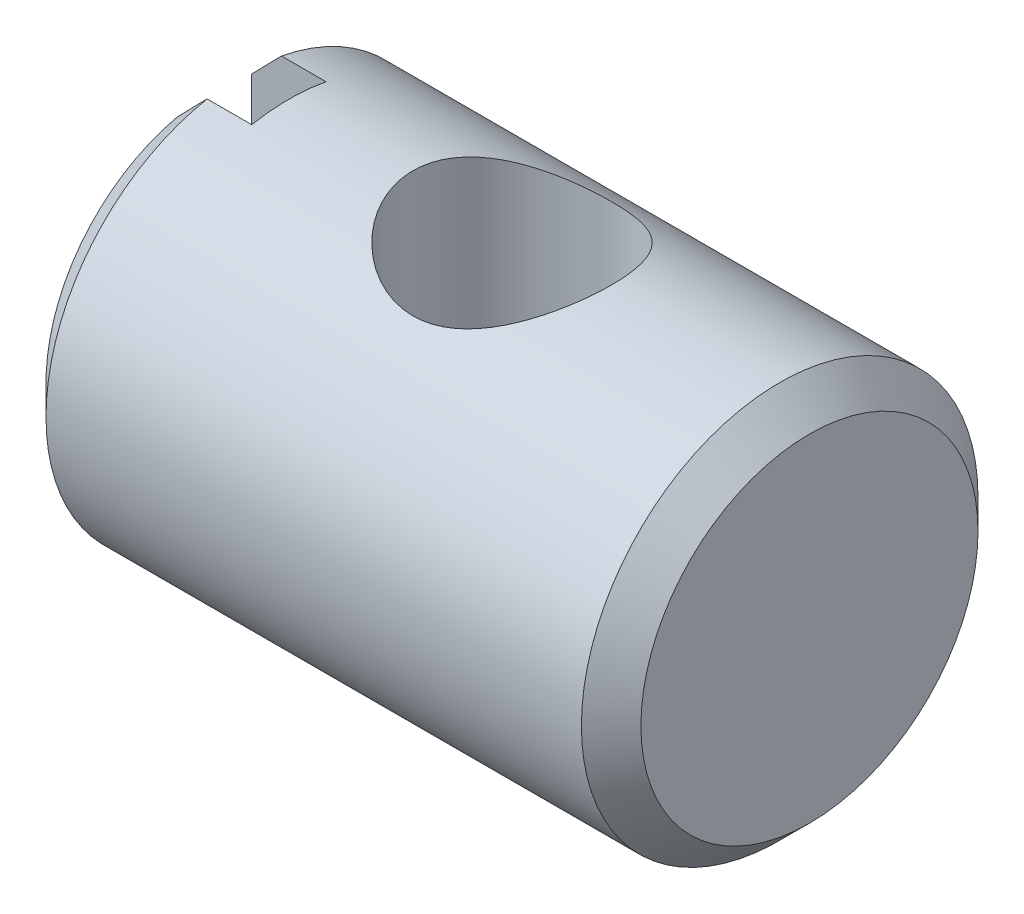
ISO-10303-21;
HEADER;
FILE_DESCRIPTION(('STEP AP214'),'2;1');
FILE_NAME('part.step','',(''),(''),'','','');
FILE_SCHEMA(('AUTOMOTIVE_DESIGN { 1 0 10303 214 1 1 1 1 }'));
ENDSEC;
DATA;
#1=APPLICATION_CONTEXT('core data for automotive mechanical design processes');
#2=APPLICATION_PROTOCOL_DEFINITION('international standard','automotive_design',2000,#1);
#3=PRODUCT_CONTEXT('',#1,'mechanical');
#4=PRODUCT('Part','Part','',(#3));
#5=PRODUCT_RELATED_PRODUCT_CATEGORY('part','',(#4));
#6=PRODUCT_DEFINITION_FORMATION('','',#4);
#7=PRODUCT_DEFINITION_CONTEXT('part definition',#1,'design');
#8=PRODUCT_DEFINITION('design','',#6,#7);
#9=PRODUCT_DEFINITION_SHAPE('','',#8);
#10=(LENGTH_UNIT() NAMED_UNIT(*) SI_UNIT(.MILLI.,.METRE.));
#11=(NAMED_UNIT(*) PLANE_ANGLE_UNIT() SI_UNIT($,.RADIAN.));
#12=(NAMED_UNIT(*) SI_UNIT($,.STERADIAN.) SOLID_ANGLE_UNIT());
#13=UNCERTAINTY_MEASURE_WITH_UNIT(LENGTH_MEASURE(1.E-05),#10,'distance_accuracy_value','');
#14=(GEOMETRIC_REPRESENTATION_CONTEXT(3) GLOBAL_UNCERTAINTY_ASSIGNED_CONTEXT((#13)) GLOBAL_UNIT_ASSIGNED_CONTEXT((#10,
#11,#12)) REPRESENTATION_CONTEXT('',''));
#15=CARTESIAN_POINT('',(0.,0.,0.));
#16=DIRECTION('',(0.,0.,1.));
#17=DIRECTION('',(1.,0.,0.));
#18=AXIS2_PLACEMENT_3D('',#15,#16,#17);
#19=CARTESIAN_POINT('',(-6.,0.,0.));
#20=DIRECTION('',(1.,0.,0.));
#21=DIRECTION('',(0.,0.,-1.));
#22=AXIS2_PLACEMENT_3D('',#19,#20,#21);
#23=PLANE('',#22);
#24=CARTESIAN_POINT('',(-6.,0.,0.));
#25=DIRECTION('',(1.,0.,0.));
#26=DIRECTION('',(0.,0.,-1.));
#27=AXIS2_PLACEMENT_3D('',#24,#25,#26);
#28=CIRCLE('',#27,3.4);
#29=CARTESIAN_POINT('',(-6.,3.31624787975808,-0.75));
#30=VERTEX_POINT('',#29);
#31=CARTESIAN_POINT('',(-6.,-3.31624787975808,-0.75));
#32=VERTEX_POINT('',#31);
#33=EDGE_CURVE('E104',#30,#32,#28,.F.);
#34=ORIENTED_EDGE('',*,*,#33,.T.);
#35=DIRECTION('',(0.,-1.,0.));
#36=VECTOR('',#35,1.);
#37=CARTESIAN_POINT('',(-6.,-5.08936353423906,-0.75));
#38=LINE('',#37,#36);
#39=EDGE_CURVE('E100',#30,#32,#38,.T.);
#40=ORIENTED_EDGE('',*,*,#39,.F.);
#41=EDGE_LOOP('',(#34,#40));
#42=FACE_BOUND('',#41,.T.);
#43=ADVANCED_FACE('F33',(#42),#23,.F.);
#44=CARTESIAN_POINT('',(-5.4,0.,0.));
#45=DIRECTION('',(1.,0.,0.));
#46=DIRECTION('',(0.,0.,-1.));
#47=AXIS2_PLACEMENT_3D('',#44,#45,#46);
#48=CONICAL_SURFACE('',#47,4.,0.785398163397448);
#49=CARTESIAN_POINT('',(-0.586318931168419,8.78171247440271,-0.75));
#50=CARTESIAN_POINT('',(-0.89911517881567,8.46776722729489,-0.75));
#51=CARTESIAN_POINT('',(-1.21186022148148,8.1537708958006,-0.75));
#52=CARTESIAN_POINT('',(-1.83719494459531,7.52558697275872,-0.75));
#53=CARTESIAN_POINT('',(-2.14978461487386,7.21139937108854,-0.75));
#54=CARTESIAN_POINT('',(-2.77515805316192,6.58233891694838,-0.75));
#55=CARTESIAN_POINT('',(-3.08794147672292,6.26746572194293,-0.75));
#56=CARTESIAN_POINT('',(-3.71310786552485,5.63735753970191,-0.75));
#57=CARTESIAN_POINT('',(-4.02549085255156,5.32212257408525,-0.75));
#58=CARTESIAN_POINT('',(-4.63095471200261,4.70991108309659,-0.75));
#59=CARTESIAN_POINT('',(-4.92407209660478,4.41297070666081,-0.75));
#60=CARTESIAN_POINT('',(-5.36301711479325,3.96679034127691,-0.75));
#61=CARTESIAN_POINT('',(-5.50922280774287,3.81792242946439,-0.75));
#62=CARTESIAN_POINT('',(-5.8012714742329,3.51983580450674,-0.75));
#63=CARTESIAN_POINT('',(-5.94711445356469,3.37061709703764,-0.75));
#64=CARTESIAN_POINT('',(-6.23815525647998,3.07179369372605,-0.75));
#65=CARTESIAN_POINT('',(-6.383353516978,2.92218942405654,-0.75));
#66=CARTESIAN_POINT('',(-6.6729455601872,2.62218613066518,-0.75));
#67=CARTESIAN_POINT('',(-6.81733929236243,2.47178705814911,-0.75));
#68=CARTESIAN_POINT('',(-7.10475426782723,2.16976130425436,-0.75));
#69=CARTESIAN_POINT('',(-7.2477759093094,2.01813500412178,-0.75));
#70=CARTESIAN_POINT('',(-7.46040576630658,1.78894239159525,-0.75));
#71=CARTESIAN_POINT('',(-7.53096183090568,1.71225650870654,-0.75));
#72=CARTESIAN_POINT('',(-7.67114403465676,1.55804045062791,-0.75));
#73=CARTESIAN_POINT('',(-7.74077020981574,1.48051030834152,-0.75));
#74=CARTESIAN_POINT('',(-7.82894089355626,1.38051818592761,-0.75));
#75=CARTESIAN_POINT('',(-7.84814001283776,1.35863324199629,-0.75));
#76=CARTESIAN_POINT('',(-7.88640996667428,1.31475109781654,-0.75));
#77=CARTESIAN_POINT('',(-7.9054807998849,1.29275389639593,-0.75));
#78=CARTESIAN_POINT('',(-7.96247837839367,1.22656954820506,-0.75));
#79=CARTESIAN_POINT('',(-8.00018671971951,1.18219359522638,-0.75));
#80=CARTESIAN_POINT('',(-8.07521139767381,1.09232954284376,-0.75));
#81=CARTESIAN_POINT('',(-8.11251967226824,1.04683469214758,-0.75));
#82=CARTESIAN_POINT('',(-8.18603196961103,0.954975461061185,-0.75));
#83=CARTESIAN_POINT('',(-8.22223626899139,0.908611303281593,-0.75));
#84=CARTESIAN_POINT('',(-8.29348308271563,0.814159220934126,-0.75));
#85=CARTESIAN_POINT('',(-8.32850767361611,0.76605767964873,-0.75));
#86=CARTESIAN_POINT('',(-8.39620368659304,0.668105125068649,-0.75));
#87=CARTESIAN_POINT('',(-8.42887194187332,0.618251886557387,-0.75));
#88=CARTESIAN_POINT('',(-8.49011198361584,0.516746551056438,-0.75));
#89=CARTESIAN_POINT('',(-8.51872209860146,0.465117942665969,-0.75));
#90=CARTESIAN_POINT('',(-8.56982814317297,0.358933249234864,-0.75));
#91=CARTESIAN_POINT('',(-8.59234286669187,0.30438679840185,-0.75));
#92=CARTESIAN_POINT('',(-8.61802261195062,0.222661735256584,-0.75));
#93=CARTESIAN_POINT('',(-8.62505610986014,0.196705154324282,-0.75));
#94=CARTESIAN_POINT('',(-8.63668327119189,0.144243129404284,-0.75));
#95=CARTESIAN_POINT('',(-8.64127731698223,0.117737772110777,-0.75));
#96=CARTESIAN_POINT('',(-8.64768999327354,0.0645252709876592,-0.75));
#97=CARTESIAN_POINT('',(-8.64952279966187,0.0378198701031724,-0.75));
#98=CARTESIAN_POINT('',(-8.6503131508692,-0.0156348454490843,-0.75));
#99=CARTESIAN_POINT('',(-8.6492706759624,-0.0423841604168676,-0.75));
#100=CARTESIAN_POINT('',(-8.64440528787136,-0.0955002479492756,-0.75));
#101=CARTESIAN_POINT('',(-8.64059501621247,-0.121868205752437,-0.75));
#102=CARTESIAN_POINT('',(-8.63048014930018,-0.174123602459967,-0.75));
#103=CARTESIAN_POINT('',(-8.62417444936742,-0.200010823230418,-0.75));
#104=CARTESIAN_POINT('',(-8.60939063400642,-0.251340911559103,-0.75));
#105=CARTESIAN_POINT('',(-8.60089783294052,-0.276779482055886,-0.75));
#106=CARTESIAN_POINT('',(-8.58215088842634,-0.326984908378452,-0.75));
#107=CARTESIAN_POINT('',(-8.57189700515739,-0.351751862802719,-0.75));
#108=CARTESIAN_POINT('',(-8.54184128834097,-0.41879721358808,-0.75));
#109=CARTESIAN_POINT('',(-8.52060179926991,-0.460428199746916,-0.75));
#110=CARTESIAN_POINT('',(-8.47522317647946,-0.54209238327936,-0.75));
#111=CARTESIAN_POINT('',(-8.4510808862854,-0.582123777113933,-0.75));
#112=CARTESIAN_POINT('',(-8.40072672716821,-0.661038955930545,-0.75));
#113=CARTESIAN_POINT('',(-8.37450825006854,-0.699918487179986,-0.75));
#114=CARTESIAN_POINT('',(-8.32065019422312,-0.776685038987865,-0.75));
#115=CARTESIAN_POINT('',(-8.29301026661477,-0.814571812419269,-0.75));
#116=CARTESIAN_POINT('',(-8.2080605632463,-0.927765545716539,-0.75));
#117=CARTESIAN_POINT('',(-8.1491930190133,-1.00189997374979,-0.75));
#118=CARTESIAN_POINT('',(-8.05923063658955,-1.11156691284701,-0.75));
#119=CARTESIAN_POINT('',(-8.02900134378288,-1.14782675761595,-0.75));
#120=CARTESIAN_POINT('',(-7.96807610532063,-1.21995170040627,-0.75));
#121=CARTESIAN_POINT('',(-7.93738017859007,-1.25581681433537,-0.75));
#122=CARTESIAN_POINT('',(-7.84607570269691,-1.36140263252394,-0.75));
#123=CARTESIAN_POINT('',(-7.78495259254737,-1.4306773325886,-0.75));
#124=CARTESIAN_POINT('',(-7.66177481425132,-1.56839537144039,-0.75));
#125=CARTESIAN_POINT('',(-7.59972010396873,-1.63683867236869,-0.75));
#126=CARTESIAN_POINT('',(-7.41257753872586,-1.84130512640933,-0.75));
#127=CARTESIAN_POINT('',(-7.28652759563928,-1.97644628187093,-0.75));
#128=CARTESIAN_POINT('',(-7.03290023140085,-2.24558248181855,-0.75));
#129=CARTESIAN_POINT('',(-6.90532117214649,-2.37957597237069,-0.75));
#130=CARTESIAN_POINT('',(-6.64931980167584,-2.64673393796254,-0.75));
#131=CARTESIAN_POINT('',(-6.52089755906573,-2.779898478774,-0.75));
#132=CARTESIAN_POINT('',(-6.26467750445008,-3.04447337872307,-0.75));
#133=CARTESIAN_POINT('',(-6.1368847414103,-3.17588863552843,-0.75));
#134=CARTESIAN_POINT('',(-5.88091851050585,-3.43835302392329,-0.75));
#135=CARTESIAN_POINT('',(-5.75274503479878,-3.56940214786129,-0.75));
#136=CARTESIAN_POINT('',(-5.36794145192988,-3.96203591841447,-0.75));
#137=CARTESIAN_POINT('',(-5.1109107523662,-4.22322777332833,-0.75));
#138=CARTESIAN_POINT('',(-4.50104911211646,-4.84155706238019,-0.75));
#139=CARTESIAN_POINT('',(-4.1479586197436,-5.19843819113416,-0.75));
#140=CARTESIAN_POINT('',(-3.44112712202132,-5.91167425229548,-0.75));
#141=CARTESIAN_POINT('',(-3.08738601726198,-6.26802908612066,-0.75));
#142=CARTESIAN_POINT('',(-2.37586014632471,-6.98410294385875,-0.75));
#143=CARTESIAN_POINT('',(-2.01807168367367,-7.3438182936353,-0.75));
#144=CARTESIAN_POINT('',(-1.30231546818728,-8.06294690781502,-0.75));
#145=CARTESIAN_POINT('',(-0.944347757003069,-8.42236021366946,-0.75));
#146=CARTESIAN_POINT('',(-0.586318931168417,-8.78171247440271,-0.75));
#147=B_SPLINE_CURVE_WITH_KNOTS('',3,(#49,#50,#51,#52,#53,#54,#55,#56,#57,#58,#59,#60,#61,#62,
#63,#64,#65,#66,#67,#68,#69,#70,#71,#72,#73,#74,#75,#76,#77,#78,#79,#80,#81,#82,#83,#84,#85,#86,
#87,#88,#89,#90,#91,#92,#93,#94,#95,#96,#97,#98,#99,#100,#101,#102,#103,#104,#105,#106,#107,
#108,#109,#110,#111,#112,#113,#114,#115,#116,#117,#118,#119,#120,#121,#122,#123,#124,#125,#126,
#127,#128,#129,#130,#131,#132,#133,#134,#135,#136,#137,#138,#139,#140,#141,#142,#143,#144,#145,
#146),.UNSPECIFIED.,.F.,.F.,(4,2,2,2,2,2,2,2,2,2,2,2,2,2,2,2,2,2,2,2,2,2,2,2,2,2,2,2,2,2,2,2,2,
2,2,2,2,2,2,2,2,2,2,2,2,2,2,2,4),(0.,1.32952178021047,2.65912141007806,3.99058931393997,
5.32198141209922,6.57370761891138,7.19967829346922,7.82563890828647,8.4510770098977,
9.07655396485851,9.70184354845619,10.0144573204168,10.3270589521031,10.4143970118987,
10.5017359855475,10.6764297027325,10.8529263362068,11.0293783738681,11.2078396541179,
11.3865364730812,11.5634135355288,11.7397388554671,11.8203206265103,11.9008897631582,
11.9810438404542,12.0611984676466,12.1409892833747,12.2208154605846,12.3011922923892,
12.3815572596538,12.5215743525672,12.6617450994075,12.8023814540204,12.9430524908892,
13.2269383623233,13.3685623250766,13.5101805593087,13.7873224586822,14.0644769311188,
14.618860032613,15.1739023545605,15.72890006137,16.2788161077102,16.828743561587,
17.9280930269899,19.4341905537046,20.9405413578846,22.4626021474749,23.9843999937849),.UNSPECIFIED.);
#148=CARTESIAN_POINT('',(-5.4,3.92905841137543,-0.75));
#149=VERTEX_POINT('',#148);
#150=EDGE_CURVE('E155',#149,#30,#147,.T.);
#151=ORIENTED_EDGE('',*,*,#150,.F.);
#152=CARTESIAN_POINT('',(-5.4,0.,0.));
#153=DIRECTION('',(1.,0.,0.));
#154=DIRECTION('',(0.,0.,-1.));
#155=AXIS2_PLACEMENT_3D('',#152,#153,#154);
#156=CIRCLE('',#155,4.);
#157=CARTESIAN_POINT('',(-5.4,-3.92905841137543,-0.75));
#158=VERTEX_POINT('',#157);
#159=EDGE_CURVE('E112',#158,#149,#156,.T.);
#160=ORIENTED_EDGE('',*,*,#159,.F.);
#161=EDGE_CURVE('E93',#32,#158,#147,.T.);
#162=ORIENTED_EDGE('',*,*,#161,.F.);
#163=ORIENTED_EDGE('',*,*,#33,.F.);
#164=EDGE_LOOP('',(#151,#160,#162,#163));
#165=FACE_BOUND('',#164,.T.);
#166=ADVANCED_FACE('F144',(#165),#48,.T.);
#167=CARTESIAN_POINT('',(6.,0.,0.));
#168=DIRECTION('',(-1.,0.,0.));
#169=DIRECTION('',(0.,0.,1.));
#170=AXIS2_PLACEMENT_3D('',#167,#168,#169);
#171=CYLINDRICAL_SURFACE('',#170,4.);
#172=ORIENTED_EDGE('',*,*,#159,.T.);
#173=DIRECTION('',(-1.,0.,0.));
#174=VECTOR('',#173,1.);
#175=CARTESIAN_POINT('',(6.,3.92905841137543,-0.75));
#176=LINE('',#175,#174);
#177=CARTESIAN_POINT('',(-4.5,3.92905841137543,-0.75));
#178=VERTEX_POINT('',#177);
#179=EDGE_CURVE('E56',#149,#178,#176,.F.);
#180=ORIENTED_EDGE('',*,*,#179,.T.);
#181=CARTESIAN_POINT('',(-4.5,0.,0.));
#182=DIRECTION('',(-1.,0.,0.));
#183=DIRECTION('',(0.,0.,1.));
#184=AXIS2_PLACEMENT_3D('',#181,#182,#183);
#185=CIRCLE('',#184,4.);
#186=CARTESIAN_POINT('',(-4.5,3.92905841137543,0.75));
#187=VERTEX_POINT('',#186);
#188=EDGE_CURVE('E11',#187,#178,#185,.T.);
#189=ORIENTED_EDGE('',*,*,#188,.F.);
#190=DIRECTION('',(-1.,0.,0.));
#191=VECTOR('',#190,1.);
#192=CARTESIAN_POINT('',(6.,3.92905841137543,0.75));
#193=LINE('',#192,#191);
#194=CARTESIAN_POINT('',(-5.4,3.92905841137543,0.75));
#195=VERTEX_POINT('',#194);
#196=EDGE_CURVE('E182',#187,#195,#193,.T.);
#197=ORIENTED_EDGE('',*,*,#196,.T.);
#198=CARTESIAN_POINT('',(-5.4,-3.92905841137543,0.75));
#199=VERTEX_POINT('',#198);
#200=EDGE_CURVE('E110',#195,#199,#156,.T.);
#201=ORIENTED_EDGE('',*,*,#200,.T.);
#202=DIRECTION('',(-1.,0.,0.));
#203=VECTOR('',#202,1.);
#204=CARTESIAN_POINT('',(6.,-3.92905841137543,0.75));
#205=LINE('',#204,#203);
#206=CARTESIAN_POINT('',(-4.5,-3.92905841137543,0.75));
#207=VERTEX_POINT('',#206);
#208=EDGE_CURVE('E88',#199,#207,#205,.F.);
#209=ORIENTED_EDGE('',*,*,#208,.T.);
#210=CARTESIAN_POINT('',(-4.5,-3.92905841137543,-0.75));
#211=VERTEX_POINT('',#210);
#212=EDGE_CURVE('E37',#211,#207,#185,.T.);
#213=ORIENTED_EDGE('',*,*,#212,.F.);
#214=DIRECTION('',(-1.,0.,0.));
#215=VECTOR('',#214,1.);
#216=CARTESIAN_POINT('',(6.,-3.92905841137543,-0.75));
#217=LINE('',#216,#215);
#218=EDGE_CURVE('E181',#211,#158,#217,.T.);
#219=ORIENTED_EDGE('',*,*,#218,.T.);
#220=EDGE_LOOP('',(#172,#180,#189,#197,#201,#209,#213,#219));
#221=FACE_BOUND('',#220,.T.);
#222=CARTESIAN_POINT('',(-2.,-4.,0.));
#223=CARTESIAN_POINT('',(-1.99999339536562,-3.99999426810082,0.105143925902467));
#224=CARTESIAN_POINT('',(-1.99165985375789,-3.99580982039513,0.210413199395125));
#225=CARTESIAN_POINT('',(-1.95869423931692,-3.97948312074314,0.417840470537792));
#226=CARTESIAN_POINT('',(-1.93403121400437,-3.96732575657839,0.519992173427259));
#227=CARTESIAN_POINT('',(-1.86961238276674,-3.93632558806751,0.717867089760897));
#228=CARTESIAN_POINT('',(-1.82991523150406,-3.91750878355075,0.813613605878292));
#229=CARTESIAN_POINT('',(-1.73685875727003,-3.87491553031523,0.996945233613197));
#230=CARTESIAN_POINT('',(-1.68350051150227,-3.8511394726705,1.08453098798012));
#231=CARTESIAN_POINT('',(-1.56096550102943,-3.79912516516124,1.25501563552382));
#232=CARTESIAN_POINT('',(-1.49102704152072,-3.77070398255074,1.33731042224422));
#233=CARTESIAN_POINT('',(-1.33895704150593,-3.71319940493486,1.48955888973396));
#234=CARTESIAN_POINT('',(-1.25681629645512,-3.68411552418069,1.55950316621353));
#235=CARTESIAN_POINT('',(-1.07503330095324,-3.62597902394695,1.69050400090056));
#236=CARTESIAN_POINT('',(-0.974527803308175,-3.59710373940264,1.75045067110327));
#237=CARTESIAN_POINT('',(-0.763265328027571,-3.54571957544641,1.85233645378139));
#238=CARTESIAN_POINT('',(-0.652515742554502,-3.52320615213979,1.89428842993267));
#239=CARTESIAN_POINT('',(-0.430669789156156,-3.48915734075617,1.95626488437718));
#240=CARTESIAN_POINT('',(-0.319991095865212,-3.47704543167427,1.97745171416088));
#241=CARTESIAN_POINT('',(-0.0960423244410468,-3.46363779897055,2.00085398661769));
#242=CARTESIAN_POINT('',(0.017225081742309,-3.46233138686576,2.00308817674615));
#243=CARTESIAN_POINT('',(0.228572048630736,-3.47021860514497,1.98937457434459));
#244=CARTESIAN_POINT('',(0.3268480624461,-3.47817527324027,1.97556911907364));
#245=CARTESIAN_POINT('',(0.519443818746084,-3.50152457467701,1.93387969811386));
#246=CARTESIAN_POINT('',(0.613762290610631,-3.51691957663553,1.9059912477953));
#247=CARTESIAN_POINT('',(0.798458265131318,-3.55374952825482,1.83641956077201));
#248=CARTESIAN_POINT('',(0.888692797571577,-3.57531681327997,1.79443013423199));
#249=CARTESIAN_POINT('',(1.06126858518002,-3.62206808562807,1.698083375336));
#250=CARTESIAN_POINT('',(1.14360627120018,-3.64725369560381,1.64372048762494));
#251=CARTESIAN_POINT('',(1.30904250548645,-3.70226315806572,1.51613210982558));
#252=CARTESIAN_POINT('',(1.39091374715231,-3.73227020473492,1.44138891673856));
#253=CARTESIAN_POINT('',(1.5414708371818,-3.79095246600814,1.27911115748275));
#254=CARTESIAN_POINT('',(1.61015038406777,-3.81962703917602,1.19157051314857));
#255=CARTESIAN_POINT('',(1.73537132205945,-3.87403974565928,1.0010330116637));
#256=CARTESIAN_POINT('',(1.79120094489148,-3.89957968324014,0.897507183198818));
#257=CARTESIAN_POINT('',(1.88419405808602,-3.94315762242485,0.680932430977594));
#258=CARTESIAN_POINT('',(1.92137237003033,-3.96120157887106,0.567891152530552));
#259=CARTESIAN_POINT('',(1.97295080743335,-3.98648667482871,0.345532983321405));
#260=CARTESIAN_POINT('',(1.98898247149356,-3.9944987660262,0.236683061096653));
#261=CARTESIAN_POINT('',(2.00292946226897,-4.00146026918207,0.0175591998987039));
#262=CARTESIAN_POINT('',(2.00085337127894,-4.00041397442637,-0.0927140397398167));
#263=CARTESIAN_POINT('',(1.97958662316251,-3.9898238450687,-0.302465943971973));
#264=CARTESIAN_POINT('',(1.96173493454001,-3.98094491376337,-0.402118816099859));
#265=CARTESIAN_POINT('',(1.91152385620976,-3.95644342629681,-0.596813784603881));
#266=CARTESIAN_POINT('',(1.87916286709301,-3.94082012668824,-0.691855371382173));
#267=CARTESIAN_POINT('',(1.80000306713393,-3.90368502827176,-0.877777216899145));
#268=CARTESIAN_POINT('',(1.75281789976743,-3.88201763539262,-0.968460794011606));
#269=CARTESIAN_POINT('',(1.64578492870687,-3.83487948634835,-1.14092272339854));
#270=CARTESIAN_POINT('',(1.58593173080921,-3.80940711133877,-1.22269725955318));
#271=CARTESIAN_POINT('',(1.44847914933857,-3.75416442672396,-1.38353537857843));
#272=CARTESIAN_POINT('',(1.36971426310971,-3.72421769686998,-1.46154415563805));
#273=CARTESIAN_POINT('',(1.20014969744455,-3.6652478321764,-1.60371264223771));
#274=CARTESIAN_POINT('',(1.10934176230416,-3.63622534800094,-1.66786277142375));
#275=CARTESIAN_POINT('',(0.912712691654049,-3.58102384412979,-1.78341582895803));
#276=CARTESIAN_POINT('',(0.806377467811038,-3.55505059178121,-1.8340509916005));
#277=CARTESIAN_POINT('',(0.584979864850069,-3.51148144588269,-1.91616565186941));
#278=CARTESIAN_POINT('',(0.469928947066221,-3.493874764435,-1.94766983173403));
#279=CARTESIAN_POINT('',(0.246179554230593,-3.47123002051604,-1.98772337493374));
#280=CARTESIAN_POINT('',(0.137931493129518,-3.4651476693013,-1.9981859928109));
#281=CARTESIAN_POINT('',(-0.0788941343290485,-3.46330709283206,-2.0013783087524));
#282=CARTESIAN_POINT('',(-0.187471537475722,-3.4675443925278,-1.99411569324648));
#283=CARTESIAN_POINT('',(-0.390967003066873,-3.48475724102153,-1.96385225118662));
#284=CARTESIAN_POINT('',(-0.486200940289478,-3.49686188965317,-1.94241662868607));
#285=CARTESIAN_POINT('',(-0.671616238848732,-3.52742032375305,-1.88635071644882));
#286=CARTESIAN_POINT('',(-0.761795964184062,-3.54587615139337,-1.85171618231984));
#287=CARTESIAN_POINT('',(-0.941249701973073,-3.58857060729071,-1.76763149060113));
#288=CARTESIAN_POINT('',(-1.03005580365806,-3.61311444791841,-1.7173422756314));
#289=CARTESIAN_POINT('',(-1.19854907236252,-3.66470663269721,-1.60430194327479));
#290=CARTESIAN_POINT('',(-1.27823146104222,-3.69175627591221,-1.54154434248312));
#291=CARTESIAN_POINT('',(-1.43628396470935,-3.74924646316184,-1.39640665332275));
#292=CARTESIAN_POINT('',(-1.51331820470058,-3.77969966613256,-1.31256884599452));
#293=CARTESIAN_POINT('',(-1.65252596687054,-3.83755504519861,-1.1323096124664));
#294=CARTESIAN_POINT('',(-1.71469147893981,-3.8649555725239,-1.0358814466104));
#295=CARTESIAN_POINT('',(-1.82247272542414,-3.91396019133075,-0.831863193565893));
#296=CARTESIAN_POINT('',(-1.86796833847293,-3.93552192987866,-0.724199007553463));
#297=CARTESIAN_POINT('',(-1.93961633551482,-3.97002682597974,-0.501484202276175));
#298=CARTESIAN_POINT('',(-1.96582369361143,-3.98299446726136,-0.386455599178202));
#299=CARTESIAN_POINT('',(-1.98779482217148,-3.99390923826956,-0.225203892981792));
#300=CARTESIAN_POINT('',(-1.99236528173268,-3.99618730680502,-0.180323758883131));
#301=CARTESIAN_POINT('',(-1.99846933102817,-3.99923393953631,-0.0903034636101842));
#302=CARTESIAN_POINT('',(-2.00000283694042,-4.00000246206762,-0.0451632952932574));
#303=CARTESIAN_POINT('',(-2.,-4.,0.));
#304=B_SPLINE_CURVE_WITH_KNOTS('',3,(#222,#223,#224,#225,#226,#227,#228,#229,#230,#231,#232,
#233,#234,#235,#236,#237,#238,#239,#240,#241,#242,#243,#244,#245,#246,#247,#248,#249,#250,#251,
#252,#253,#254,#255,#256,#257,#258,#259,#260,#261,#262,#263,#264,#265,#266,#267,#268,#269,#270,
#271,#272,#273,#274,#275,#276,#277,#278,#279,#280,#281,#282,#283,#284,#285,#286,#287,#288,#289,
#290,#291,#292,#293,#294,#295,#296,#297,#298,#299,#300,#301,#302,#303),.UNSPECIFIED.,.T.,.F.,(4,
2,2,2,2,2,2,2,2,2,2,2,2,2,2,2,2,2,2,2,2,2,2,2,2,2,2,2,2,2,2,2,2,2,2,2,2,2,2,2,4),(0.,
0.315248514840585,0.631096299418395,0.945724310984596,1.26032752116313,1.59396351743618,
1.92785247530807,2.28763452861505,2.64715895796562,2.98516024280459,3.32282714658041,
3.62011424818641,3.91749607851357,4.22180480336975,4.52625042520444,4.86929882667757,
5.21251069197373,5.57166044428881,5.93052433824559,6.25966580942691,6.58865129022952,
6.89213813012244,7.19565843261863,7.50785712055797,7.82018901496678,8.16319221288838,
8.50643177230863,8.86629364323451,9.22569023890901,9.55058615006093,9.87534119729357,
10.1691586049771,10.463070575767,10.7767291356057,11.0905512228726,11.4425048551434,
11.7946476676249,12.1492802732705,12.502898172423,12.6383056026783,12.7737167702213),.UNSPECIFIED.);
#305=CARTESIAN_POINT('',(-2.,-4.,0.));
#306=VERTEX_POINT('',#305);
#307=EDGE_CURVE('E121',#306,#306,#304,.T.);
#308=ORIENTED_EDGE('',*,*,#307,.T.);
#309=EDGE_LOOP('',(#308));
#310=FACE_BOUND('',#309,.T.);
#311=CARTESIAN_POINT('',(0.,3.46410161513775,2.));
#312=CARTESIAN_POINT('',(-0.104213205474344,3.46411185715888,1.99999158748781));
#313=CARTESIAN_POINT('',(-0.208562176533799,3.46887633544978,1.99179963610437));
#314=CARTESIAN_POINT('',(-0.414055177230601,3.48724701669072,1.95944672580053));
#315=CARTESIAN_POINT('',(-0.515192003247761,3.50087179788183,1.93525221095662));
#316=CARTESIAN_POINT('',(-0.710903156446934,3.53498701490002,1.8721998159803));
#317=CARTESIAN_POINT('',(-0.805509258849251,3.55544089069169,1.83341988295963));
#318=CARTESIAN_POINT('',(-0.986848450476154,3.60085327291133,1.74253507245138));
#319=CARTESIAN_POINT('',(-1.07358111343677,3.62581202301253,1.69042947410139));
#320=CARTESIAN_POINT('',(-1.24461144313338,3.67993738819289,1.569333074538));
#321=CARTESIAN_POINT('',(-1.32811826759177,3.70928127465103,1.49930407053533));
#322=CARTESIAN_POINT('',(-1.4828167805706,3.76743965382121,1.34650761698202));
#323=CARTESIAN_POINT('',(-1.55400232620397,3.79625387610258,1.26373385204841));
#324=CARTESIAN_POINT('',(-1.6867343011885,3.85242953961661,1.08097912631265));
#325=CARTESIAN_POINT('',(-1.74730753542331,3.87956212851245,0.980214377887153));
#326=CARTESIAN_POINT('',(-1.85028170678709,3.92701512184167,0.768314053336917));
#327=CARTESIAN_POINT('',(-1.8926941123508,3.94733982363631,0.657185076311985));
#328=CARTESIAN_POINT('',(-1.95500932253118,3.97760922492053,0.436089887818817));
#329=CARTESIAN_POINT('',(-1.9762990526921,3.9881896044274,0.326603580968785));
#330=CARTESIAN_POINT('',(-2.00033223736903,4.00015167691179,0.10514125740454));
#331=CARTESIAN_POINT('',(-2.00308691359628,4.00153893568935,-0.00683321168520786));
#332=CARTESIAN_POINT('',(-1.99050665205486,3.99525963833124,-0.219665048849573));
#333=CARTESIAN_POINT('',(-1.97672396895636,3.98836991784381,-0.320642398354139));
#334=CARTESIAN_POINT('',(-1.93423831219188,3.96748490519435,-0.518627543836089));
#335=CARTESIAN_POINT('',(-1.90553422204788,3.95348908132771,-0.615635042187702));
#336=CARTESIAN_POINT('',(-1.83383486782005,3.91943166575325,-0.80461878313926));
#337=CARTESIAN_POINT('',(-1.79064737365578,3.89928883058403,-0.896506847030398));
#338=CARTESIAN_POINT('',(-1.6914731675971,3.8547529197337,-1.07195360302662));
#339=CARTESIAN_POINT('',(-1.63548187339532,3.83035832314967,-1.15550929767728));
#340=CARTESIAN_POINT('',(-1.50620929693394,3.7768878879846,-1.3203473217964));
#341=CARTESIAN_POINT('',(-1.43179394334797,3.7475875199635,-1.40066815005873));
#342=CARTESIAN_POINT('',(-1.27082055013965,3.68908681173623,-1.54820874059556));
#343=CARTESIAN_POINT('',(-1.18425325545188,3.65988656531257,-1.61541842314846));
#344=CARTESIAN_POINT('',(-0.994703615151822,3.60288312184969,-1.73901066928442));
#345=CARTESIAN_POINT('',(-0.891027953891577,3.57528639981415,-1.7944346299561));
#346=CARTESIAN_POINT('',(-0.674124657282003,3.52750900557152,-1.88663822600246));
#347=CARTESIAN_POINT('',(-0.560907133964873,3.50732060092135,-1.92343731642178));
#348=CARTESIAN_POINT('',(-0.337570977434419,3.47889271634069,-1.97436042205008));
#349=CARTESIAN_POINT('',(-0.227917761912901,3.46983311696993,-1.99005024423995));
#350=CARTESIAN_POINT('',(-0.00719731696690888,3.46235838723219,-2.00303389322285));
#351=CARTESIAN_POINT('',(0.103868858239598,3.46393573778623,-2.00034071463005));
#352=CARTESIAN_POINT('',(0.311307837157438,3.4766867308117,-1.97807208668793));
#353=CARTESIAN_POINT('',(0.407958902215785,3.48679175013308,-1.96037563342492));
#354=CARTESIAN_POINT('',(0.596735572541989,3.51388043102682,-1.91139256926489));
#355=CARTESIAN_POINT('',(0.688859701493482,3.53086632010068,-1.88010155724727));
#356=CARTESIAN_POINT('',(0.870822661805116,3.57072444159313,-1.80329517720973));
#357=CARTESIAN_POINT('',(0.960358033706051,3.59383286486126,-1.7571881273853));
#358=CARTESIAN_POINT('',(1.13093854307904,3.643122389945,-1.65257412803176));
#359=CARTESIAN_POINT('',(1.21197928703051,3.66930506710298,-1.59406080866498));
#360=CARTESIAN_POINT('',(1.37395753504266,3.72575996912669,-1.45767433439708));
#361=CARTESIAN_POINT('',(1.45359430141778,3.75613166308566,-1.37829054462748));
#362=CARTESIAN_POINT('',(1.59882447600473,3.81468469955797,-1.20680899079904));
#363=CARTESIAN_POINT('',(1.66441314052684,3.84286530015463,-1.11470694931991));
#364=CARTESIAN_POINT('',(1.78114745183271,3.89482723381868,-0.917070725108058));
#365=CARTESIAN_POINT('',(1.83186623616677,3.91847283343884,-0.811246195112494));
#366=CARTESIAN_POINT('',(1.91427580796961,3.95766709918776,-0.591044729317865));
#367=CARTESIAN_POINT('',(1.9459833036841,3.97322287353397,-0.476675402917652));
#368=CARTESIAN_POINT('',(1.98673712748514,3.99335016363174,-0.253959364539763));
#369=CARTESIAN_POINT('',(1.99759574866428,3.9987985581427,-0.146022887268299));
#370=CARTESIAN_POINT('',(2.00168653399567,4.00084260752374,0.0702519714699466));
#371=CARTESIAN_POINT('',(1.99492486852887,3.99744136141634,0.178590198981615));
#372=CARTESIAN_POINT('',(1.9651671756836,3.98267937668509,0.38507598613686));
#373=CARTESIAN_POINT('',(1.94327026269095,3.97185789309443,0.483424641057419));
#374=CARTESIAN_POINT('',(1.88534604019333,3.94384187353387,0.674891898931565));
#375=CARTESIAN_POINT('',(1.84931670429309,3.92664642364424,0.768009749669773));
#376=CARTESIAN_POINT('',(1.7625457450086,3.8865186139318,0.950846833596741));
#377=CARTESIAN_POINT('',(1.71124078024814,3.86337234005404,1.0402503657229));
#378=CARTESIAN_POINT('',(1.59608471188191,3.81376266676027,1.20954920326828));
#379=CARTESIAN_POINT('',(1.53222784589843,3.78729774583427,1.28944011444319));
#380=CARTESIAN_POINT('',(1.38640336444059,3.73057218840582,1.44582833859495));
#381=CARTESIAN_POINT('',(1.30326581919971,3.70019591726075,1.52119665879199));
#382=CARTESIAN_POINT('',(1.12510777169391,3.64126158628571,1.65732528394006));
#383=CARTESIAN_POINT('',(1.03007686863948,3.61270515130784,1.71807266521244));
#384=CARTESIAN_POINT('',(0.826691105869755,3.55999186256751,1.82486714716811));
#385=CARTESIAN_POINT('',(0.718010089264727,3.53600256268535,1.87038902381914));
#386=CARTESIAN_POINT('',(0.549421880369055,3.5069621813237,1.92395929504801));
#387=CARTESIAN_POINT('',(0.492352179409321,3.49844389329401,1.93935666147967));
#388=CARTESIAN_POINT('',(0.376767442499811,3.48406059323535,1.96508069805043));
#389=CARTESIAN_POINT('',(0.318253447245748,3.47819372636051,1.97541091343282));
#390=CARTESIAN_POINT('',(0.21639921075271,3.47059023668758,1.9887293296122));
#391=CARTESIAN_POINT('',(0.173266942749926,3.46816389731816,1.99295091983786));
#392=CARTESIAN_POINT('',(0.0867643069071045,3.46491740045177,1.99858810035606));
#393=CARTESIAN_POINT('',(0.0433939233333004,3.46409735040492,2.00000350293331));
#394=CARTESIAN_POINT('',(0.,3.46410161513775,2.));
#395=B_SPLINE_CURVE_WITH_KNOTS('',3,(#311,#312,#313,#314,#315,#316,#317,#318,#319,#320,#321,
#322,#323,#324,#325,#326,#327,#328,#329,#330,#331,#332,#333,#334,#335,#336,#337,#338,#339,#340,
#341,#342,#343,#344,#345,#346,#347,#348,#349,#350,#351,#352,#353,#354,#355,#356,#357,#358,#359,
#360,#361,#362,#363,#364,#365,#366,#367,#368,#369,#370,#371,#372,#373,#374,#375,#376,#377,#378,
#379,#380,#381,#382,#383,#384,#385,#386,#387,#388,#389,#390,#391,#392,#393,#394),.UNSPECIFIED.,
.T.,.F.,(4,2,2,2,2,2,2,2,2,2,2,2,2,2,2,2,2,2,2,2,2,2,2,2,2,2,2,2,2,2,2,2,2,2,2,2,2,2,2,2,2,4),
(0.,0.312464245189431,0.62558578564961,0.937057191861536,1.24854545093097,1.58572462503713,
1.92307142172809,2.28315784481594,2.64301653931849,2.97726969939937,3.31132047376147,
3.61632194973143,3.92134625038977,4.2305906946636,4.5399459870461,4.87854382917848,
5.21740096495904,5.57777683462963,5.93777548427476,6.2692458171249,6.60048186380813,
6.89548366852118,7.19058104876193,7.49934592816242,7.80826972444161,8.15613487165293,
8.50411729960471,8.86128362829998,9.2181355962161,9.5422454078304,9.8662417359201,
10.1688884974705,10.4715786702809,10.7872150144301,11.1029966020551,11.450204837042,
11.7977188569438,12.1562149808128,12.3351395323571,12.5139387197526,12.6440387634036,
12.7741475095882),.UNSPECIFIED.);
#396=CARTESIAN_POINT('',(0.,3.46410161513775,2.));
#397=VERTEX_POINT('',#396);
#398=EDGE_CURVE('E107',#397,#397,#395,.T.);
#399=ORIENTED_EDGE('',*,*,#398,.T.);
#400=EDGE_LOOP('',(#399));
#401=FACE_BOUND('',#400,.T.);
#402=CARTESIAN_POINT('',(5.4,0.,0.));
#403=DIRECTION('',(1.,0.,0.));
#404=DIRECTION('',(0.,0.,-1.));
#405=AXIS2_PLACEMENT_3D('',#402,#403,#404);
#406=CIRCLE('',#405,4.);
#407=CARTESIAN_POINT('',(5.4,0.,4.));
#408=VERTEX_POINT('',#407);
#409=EDGE_CURVE('E185',#408,#408,#406,.F.);
#410=ORIENTED_EDGE('',*,*,#409,.T.);
#411=EDGE_LOOP('',(#410));
#412=FACE_BOUND('',#411,.T.);
#413=ADVANCED_FACE('F124',(#221,#310,#401,#412),#171,.T.);
#414=CARTESIAN_POINT('',(6.,0.,0.));
#415=DIRECTION('',(1.,0.,0.));
#416=DIRECTION('',(0.,0.,-1.));
#417=AXIS2_PLACEMENT_3D('',#414,#415,#416);
#418=PLANE('',#417);
#419=CARTESIAN_POINT('',(6.,0.,0.));
#420=DIRECTION('',(1.,0.,0.));
#421=DIRECTION('',(0.,0.,-1.));
#422=AXIS2_PLACEMENT_3D('',#419,#420,#421);
#423=CIRCLE('',#422,3.4);
#424=CARTESIAN_POINT('',(6.,0.,3.4));
#425=VERTEX_POINT('',#424);
#426=EDGE_CURVE('E103',#425,#425,#423,.T.);
#427=ORIENTED_EDGE('',*,*,#426,.T.);
#428=EDGE_LOOP('',(#427));
#429=FACE_BOUND('',#428,.T.);
#430=ADVANCED_FACE('F136',(#429),#418,.T.);
#431=CARTESIAN_POINT('',(-6.,-3.31624787975808,0.75));
#432=VERTEX_POINT('',#431);
#433=CARTESIAN_POINT('',(-6.,3.31624787975808,0.75));
#434=VERTEX_POINT('',#433);
#435=EDGE_CURVE('E99',#432,#434,#28,.F.);
#436=ORIENTED_EDGE('',*,*,#435,.T.);
#437=DIRECTION('',(0.,1.,0.));
#438=VECTOR('',#437,1.);
#439=CARTESIAN_POINT('',(-6.,-5.08936353423906,0.75));
#440=LINE('',#439,#438);
#441=EDGE_CURVE('E48',#432,#434,#440,.T.);
#442=ORIENTED_EDGE('',*,*,#441,.F.);
#443=EDGE_LOOP('',(#436,#442));
#444=FACE_BOUND('',#443,.T.);
#445=ADVANCED_FACE('F98',(#444),#23,.F.);
#446=CARTESIAN_POINT('',(-0.586318931168417,-8.78171247440271,0.75));
#447=CARTESIAN_POINT('',(-0.899115178815668,-8.46776722729489,0.75));
#448=CARTESIAN_POINT('',(-1.21186022148148,-8.1537708958006,0.75));
#449=CARTESIAN_POINT('',(-1.83719494459531,-7.52558697275872,0.75));
#450=CARTESIAN_POINT('',(-2.14978461487386,-7.21139937108854,0.75));
#451=CARTESIAN_POINT('',(-2.77515805316192,-6.58233891694838,0.75));
#452=CARTESIAN_POINT('',(-3.08794147672292,-6.26746572194293,0.75));
#453=CARTESIAN_POINT('',(-3.71310786552485,-5.63735753970191,0.75));
#454=CARTESIAN_POINT('',(-4.02549085255156,-5.32212257408525,0.75));
#455=CARTESIAN_POINT('',(-4.63095471200261,-4.70991108309659,0.75));
#456=CARTESIAN_POINT('',(-4.92407209660478,-4.41297070666081,0.75));
#457=CARTESIAN_POINT('',(-5.36301711479325,-3.96679034127691,0.75));
#458=CARTESIAN_POINT('',(-5.50922280774287,-3.81792242946439,0.75));
#459=CARTESIAN_POINT('',(-5.8012714742329,-3.51983580450674,0.75));
#460=CARTESIAN_POINT('',(-5.94711445356469,-3.37061709703764,0.75));
#461=CARTESIAN_POINT('',(-6.23815525647998,-3.07179369372605,0.75));
#462=CARTESIAN_POINT('',(-6.383353516978,-2.92218942405654,0.75));
#463=CARTESIAN_POINT('',(-6.6729455601872,-2.62218613066518,0.75));
#464=CARTESIAN_POINT('',(-6.81733929236243,-2.47178705814911,0.75));
#465=CARTESIAN_POINT('',(-7.10475426782723,-2.16976130425436,0.75));
#466=CARTESIAN_POINT('',(-7.2477759093094,-2.01813500412178,0.75));
#467=CARTESIAN_POINT('',(-7.46040576630658,-1.78894239159525,0.75));
#468=CARTESIAN_POINT('',(-7.53096183090567,-1.71225650870654,0.75));
#469=CARTESIAN_POINT('',(-7.67114403465676,-1.55804045062791,0.75));
#470=CARTESIAN_POINT('',(-7.74077020981575,-1.48051030834152,0.75));
#471=CARTESIAN_POINT('',(-7.82894089355627,-1.38051818592761,0.75));
#472=CARTESIAN_POINT('',(-7.84814001283776,-1.35863324199629,0.75));
#473=CARTESIAN_POINT('',(-7.88640996667428,-1.31475109781654,0.75));
#474=CARTESIAN_POINT('',(-7.9054807998849,-1.29275389639592,0.75));
#475=CARTESIAN_POINT('',(-7.96247837839367,-1.22656954820506,0.75));
#476=CARTESIAN_POINT('',(-8.00018671971951,-1.18219359522638,0.75));
#477=CARTESIAN_POINT('',(-8.07521139767381,-1.09232954284376,0.75));
#478=CARTESIAN_POINT('',(-8.11251967226824,-1.04683469214758,0.75));
#479=CARTESIAN_POINT('',(-8.18603196961103,-0.954975461061185,0.75));
#480=CARTESIAN_POINT('',(-8.22223626899139,-0.908611303281593,0.75));
#481=CARTESIAN_POINT('',(-8.29348308271563,-0.814159220934126,0.75));
#482=CARTESIAN_POINT('',(-8.32850767361611,-0.76605767964873,0.75));
#483=CARTESIAN_POINT('',(-8.39620368659304,-0.668105125068649,0.75));
#484=CARTESIAN_POINT('',(-8.42887194187332,-0.618251886557387,0.75));
#485=CARTESIAN_POINT('',(-8.49011198361584,-0.516746551056438,0.75));
#486=CARTESIAN_POINT('',(-8.51872209860146,-0.465117942665969,0.75));
#487=CARTESIAN_POINT('',(-8.56982814317297,-0.358933249234864,0.75));
#488=CARTESIAN_POINT('',(-8.59234286669187,-0.30438679840185,0.75));
#489=CARTESIAN_POINT('',(-8.61802261195062,-0.222661735256586,0.75));
#490=CARTESIAN_POINT('',(-8.62505610986014,-0.196705154324284,0.75));
#491=CARTESIAN_POINT('',(-8.63668327119189,-0.144243129404286,0.75));
#492=CARTESIAN_POINT('',(-8.64127731698223,-0.117737772110779,0.75));
#493=CARTESIAN_POINT('',(-8.64768999327354,-0.0645252709876596,0.75));
#494=CARTESIAN_POINT('',(-8.64952279966187,-0.0378198701031728,0.75));
#495=CARTESIAN_POINT('',(-8.6503131508692,0.015634845449084,0.75));
#496=CARTESIAN_POINT('',(-8.6492706759624,0.0423841604168673,0.75));
#497=CARTESIAN_POINT('',(-8.64440528787136,0.0955002479492754,0.75));
#498=CARTESIAN_POINT('',(-8.64059501621247,0.121868205752437,0.75));
#499=CARTESIAN_POINT('',(-8.63048014930018,0.174123602459967,0.75));
#500=CARTESIAN_POINT('',(-8.62417444936742,0.200010823230418,0.75));
#501=CARTESIAN_POINT('',(-8.60939063400642,0.251340911559102,0.75));
#502=CARTESIAN_POINT('',(-8.60089783294052,0.276779482055886,0.75));
#503=CARTESIAN_POINT('',(-8.58215088842634,0.326984908378452,0.75));
#504=CARTESIAN_POINT('',(-8.57189700515739,0.351751862802719,0.75));
#505=CARTESIAN_POINT('',(-8.54184128834097,0.41879721358808,0.75));
#506=CARTESIAN_POINT('',(-8.52060179926991,0.460428199746915,0.75));
#507=CARTESIAN_POINT('',(-8.47522317647946,0.542092383279359,0.75));
#508=CARTESIAN_POINT('',(-8.4510808862854,0.582123777113931,0.75));
#509=CARTESIAN_POINT('',(-8.40072672716821,0.661038955930544,0.75));
#510=CARTESIAN_POINT('',(-8.37450825006854,0.699918487179985,0.75));
#511=CARTESIAN_POINT('',(-8.32065019422312,0.776685038987865,0.75));
#512=CARTESIAN_POINT('',(-8.29301026661477,0.814571812419269,0.75));
#513=CARTESIAN_POINT('',(-8.2080605632463,0.92776554571654,0.75));
#514=CARTESIAN_POINT('',(-8.1491930190133,1.00189997374979,0.75));
#515=CARTESIAN_POINT('',(-8.05923063658955,1.11156691284701,0.75));
#516=CARTESIAN_POINT('',(-8.02900134378288,1.14782675761595,0.75));
#517=CARTESIAN_POINT('',(-7.96807610532063,1.21995170040627,0.75));
#518=CARTESIAN_POINT('',(-7.93738017859007,1.25581681433537,0.75));
#519=CARTESIAN_POINT('',(-7.8460757026969,1.36140263252394,0.75));
#520=CARTESIAN_POINT('',(-7.78495259254737,1.4306773325886,0.75));
#521=CARTESIAN_POINT('',(-7.66177481425132,1.56839537144039,0.75));
#522=CARTESIAN_POINT('',(-7.59972010396873,1.63683867236869,0.75));
#523=CARTESIAN_POINT('',(-7.41257753872586,1.84130512640934,0.75));
#524=CARTESIAN_POINT('',(-7.28652759563928,1.97644628187094,0.75));
#525=CARTESIAN_POINT('',(-7.03290023140085,2.24558248181855,0.75));
#526=CARTESIAN_POINT('',(-6.90532117214649,2.37957597237069,0.75));
#527=CARTESIAN_POINT('',(-6.64931980167584,2.64673393796254,0.75));
#528=CARTESIAN_POINT('',(-6.52089755906573,2.779898478774,0.75));
#529=CARTESIAN_POINT('',(-6.26467750445008,3.04447337872307,0.75));
#530=CARTESIAN_POINT('',(-6.1368847414103,3.17588863552843,0.75));
#531=CARTESIAN_POINT('',(-5.88091851050585,3.4383530239233,0.75));
#532=CARTESIAN_POINT('',(-5.75274503479877,3.5694021478613,0.75));
#533=CARTESIAN_POINT('',(-5.36794145192988,3.96203591841447,0.75));
#534=CARTESIAN_POINT('',(-5.11091075236619,4.22322777332834,0.75));
#535=CARTESIAN_POINT('',(-4.50104911211645,4.84155706238019,0.75));
#536=CARTESIAN_POINT('',(-4.14795861974359,5.19843819113416,0.75));
#537=CARTESIAN_POINT('',(-3.44112712202132,5.91167425229549,0.75));
#538=CARTESIAN_POINT('',(-3.08738601726198,6.26802908612066,0.75));
#539=CARTESIAN_POINT('',(-2.37586014632471,6.98410294385875,0.75));
#540=CARTESIAN_POINT('',(-2.01807168367367,7.3438182936353,0.75));
#541=CARTESIAN_POINT('',(-1.30231546818728,8.06294690781502,0.75));
#542=CARTESIAN_POINT('',(-0.94434775700307,8.42236021366945,0.75));
#543=CARTESIAN_POINT('',(-0.586318931168416,8.78171247440271,0.75));
#544=B_SPLINE_CURVE_WITH_KNOTS('',3,(#446,#447,#448,#449,#450,#451,#452,#453,#454,#455,#456,
#457,#458,#459,#460,#461,#462,#463,#464,#465,#466,#467,#468,#469,#470,#471,#472,#473,#474,#475,
#476,#477,#478,#479,#480,#481,#482,#483,#484,#485,#486,#487,#488,#489,#490,#491,#492,#493,#494,
#495,#496,#497,#498,#499,#500,#501,#502,#503,#504,#505,#506,#507,#508,#509,#510,#511,#512,#513,
#514,#515,#516,#517,#518,#519,#520,#521,#522,#523,#524,#525,#526,#527,#528,#529,#530,#531,#532,
#533,#534,#535,#536,#537,#538,#539,#540,#541,#542,#543),.UNSPECIFIED.,.F.,.F.,(4,2,2,2,2,2,2,2,
2,2,2,2,2,2,2,2,2,2,2,2,2,2,2,2,2,2,2,2,2,2,2,2,2,2,2,2,2,2,2,2,2,2,2,2,2,2,2,2,4),(0.,
1.32952178021047,2.65912141007806,3.99058931393997,5.32198141209922,6.57370761891138,
7.19967829346922,7.82563890828647,8.4510770098977,9.07655396485851,9.70184354845619,
10.0144573204168,10.3270589521031,10.4143970118987,10.5017359855475,10.6764297027325,
10.8529263362068,11.0293783738681,11.2078396541179,11.3865364730812,11.5634135355288,
11.7397388554671,11.8203206265103,11.9008897631582,11.9810438404542,12.0611984676466,
12.1409892833747,12.2208154605846,12.3011922923892,12.3815572596538,12.5215743525672,
12.6617450994075,12.8023814540204,12.9430524908892,13.2269383623233,13.3685623250766,
13.5101805593087,13.7873224586822,14.0644769311188,14.618860032613,15.1739023545605,
15.72890006137,16.2788161077102,16.828743561587,17.9280930269899,19.4341905537047,
20.9405413578846,22.4626021474749,23.9843999937849),.UNSPECIFIED.);
#545=EDGE_CURVE('E84',#199,#432,#544,.T.);
#546=ORIENTED_EDGE('',*,*,#545,.F.);
#547=ORIENTED_EDGE('',*,*,#200,.F.);
#548=EDGE_CURVE('E94',#434,#195,#544,.T.);
#549=ORIENTED_EDGE('',*,*,#548,.F.);
#550=ORIENTED_EDGE('',*,*,#435,.F.);
#551=EDGE_LOOP('',(#546,#547,#549,#550));
#552=FACE_BOUND('',#551,.T.);
#553=ADVANCED_FACE('F102',(#552),#48,.T.);
#554=CARTESIAN_POINT('',(6.,0.,0.));
#555=DIRECTION('',(-1.,0.,0.));
#556=DIRECTION('',(0.,0.,1.));
#557=AXIS2_PLACEMENT_3D('',#554,#555,#556);
#558=CONICAL_SURFACE('',#557,3.4,0.785398163397447);
#559=CARTESIAN_POINT('',(5.4,0.,4.));
#560=CARTESIAN_POINT('',(5.40625,0.,3.99375));
#561=CARTESIAN_POINT('',(5.4125,0.,3.9875));
#562=CARTESIAN_POINT('',(5.425,0.,3.975));
#563=CARTESIAN_POINT('',(5.43125,0.,3.96875));
#564=CARTESIAN_POINT('',(5.44375,0.,3.95625));
#565=CARTESIAN_POINT('',(5.45,0.,3.95));
#566=CARTESIAN_POINT('',(5.4625,0.,3.9375));
#567=CARTESIAN_POINT('',(5.46875,0.,3.93125));
#568=CARTESIAN_POINT('',(5.48125,0.,3.91875));
#569=CARTESIAN_POINT('',(5.4875,0.,3.9125));
#570=CARTESIAN_POINT('',(5.5,0.,3.9));
#571=CARTESIAN_POINT('',(5.50625,0.,3.89375));
#572=CARTESIAN_POINT('',(5.51875,0.,3.88125));
#573=CARTESIAN_POINT('',(5.525,0.,3.875));
#574=CARTESIAN_POINT('',(5.5375,0.,3.8625));
#575=CARTESIAN_POINT('',(5.54375,0.,3.85625));
#576=CARTESIAN_POINT('',(5.55625,0.,3.84375));
#577=CARTESIAN_POINT('',(5.5625,0.,3.8375));
#578=CARTESIAN_POINT('',(5.575,0.,3.825));
#579=CARTESIAN_POINT('',(5.58125,0.,3.81875));
#580=CARTESIAN_POINT('',(5.59375,0.,3.80625));
#581=CARTESIAN_POINT('',(5.6,0.,3.8));
#582=CARTESIAN_POINT('',(5.6125,0.,3.7875));
#583=CARTESIAN_POINT('',(5.61875,0.,3.78125));
#584=CARTESIAN_POINT('',(5.63125,0.,3.76875));
#585=CARTESIAN_POINT('',(5.6375,0.,3.7625));
#586=CARTESIAN_POINT('',(5.65,0.,3.75));
#587=CARTESIAN_POINT('',(5.65625,0.,3.74375));
#588=CARTESIAN_POINT('',(5.66875,0.,3.73125));
#589=CARTESIAN_POINT('',(5.675,0.,3.725));
#590=CARTESIAN_POINT('',(5.6875,0.,3.7125));
#591=CARTESIAN_POINT('',(5.69375,0.,3.70625));
#592=CARTESIAN_POINT('',(5.70625,0.,3.69375));
#593=CARTESIAN_POINT('',(5.7125,0.,3.6875));
#594=CARTESIAN_POINT('',(5.725,0.,3.675));
#595=CARTESIAN_POINT('',(5.73125,0.,3.66875));
#596=CARTESIAN_POINT('',(5.74375,0.,3.65625));
#597=CARTESIAN_POINT('',(5.75,0.,3.65));
#598=CARTESIAN_POINT('',(5.7625,0.,3.6375));
#599=CARTESIAN_POINT('',(5.76875,0.,3.63125));
#600=CARTESIAN_POINT('',(5.78125,0.,3.61875));
#601=CARTESIAN_POINT('',(5.7875,0.,3.6125));
#602=CARTESIAN_POINT('',(5.8,0.,3.6));
#603=CARTESIAN_POINT('',(5.80625,0.,3.59375));
#604=CARTESIAN_POINT('',(5.81875,0.,3.58125));
#605=CARTESIAN_POINT('',(5.825,0.,3.575));
#606=CARTESIAN_POINT('',(5.8375,0.,3.5625));
#607=CARTESIAN_POINT('',(5.84375,0.,3.55625));
#608=CARTESIAN_POINT('',(5.85625,0.,3.54375));
#609=CARTESIAN_POINT('',(5.8625,0.,3.5375));
#610=CARTESIAN_POINT('',(5.875,0.,3.525));
#611=CARTESIAN_POINT('',(5.88125,0.,3.51875));
#612=CARTESIAN_POINT('',(5.89375,0.,3.50625));
#613=CARTESIAN_POINT('',(5.9,0.,3.5));
#614=CARTESIAN_POINT('',(5.9125,0.,3.4875));
#615=CARTESIAN_POINT('',(5.91875,0.,3.48125));
#616=CARTESIAN_POINT('',(5.93125,0.,3.46875));
#617=CARTESIAN_POINT('',(5.9375,0.,3.4625));
#618=CARTESIAN_POINT('',(5.95,0.,3.45));
#619=CARTESIAN_POINT('',(5.95625,0.,3.44375));
#620=CARTESIAN_POINT('',(5.96875,0.,3.43125));
#621=CARTESIAN_POINT('',(5.975,0.,3.425));
#622=CARTESIAN_POINT('',(5.9875,0.,3.4125));
#623=CARTESIAN_POINT('',(5.99375,0.,3.40625));
#624=CARTESIAN_POINT('',(6.,0.,3.4));
#625=B_SPLINE_CURVE_WITH_KNOTS('',3,(#559,#560,#561,#562,#563,#564,#565,#566,#567,#568,#569,
#570,#571,#572,#573,#574,#575,#576,#577,#578,#579,#580,#581,#582,#583,#584,#585,#586,#587,#588,
#589,#590,#591,#592,#593,#594,#595,#596,#597,#598,#599,#600,#601,#602,#603,#604,#605,#606,#607,
#608,#609,#610,#611,#612,#613,#614,#615,#616,#617,#618,#619,#620,#621,#622,#623,#624),
.UNSPECIFIED.,.F.,.F.,(4,2,2,2,2,2,2,2,2,2,2,2,2,2,2,2,2,2,2,2,2,2,2,2,2,2,2,2,2,2,2,2,4),(0.,
0.0265165042944963,0.0530330085889914,0.079549512883487,0.106066017177983,0.132582521472478,
0.159099025766974,0.185615530061469,0.212132034355965,0.23864853865046,0.265165042944956,
0.291681547239451,0.318198051533948,0.344714555828443,0.371231060122939,0.397747564417434,
0.424264068711929,0.450780573006425,0.47729707730092,0.503813581595416,0.530330085889912,
0.556846590184408,0.583363094478903,0.609879598773399,0.636396103067894,0.662912607362389,
0.689429111656885,0.71594561595138,0.742462120245876,0.768978624540372,0.795495128834868,
0.822011633129363,0.848528137423859),.UNSPECIFIED.);
#626=EDGE_CURVE('BSEAM35',#408,#425,#625,.T.);
#627=ORIENTED_EDGE('',*,*,#409,.F.);
#628=ORIENTED_EDGE('',*,*,#426,.F.);
#629=ORIENTED_EDGE('',*,*,#626,.T.);
#630=ORIENTED_EDGE('',*,*,#626,.F.);
#631=EDGE_LOOP('',(#627,#629,#628,#630));
#632=FACE_BOUND('',#631,.T.);
#633=ADVANCED_FACE('F35',(#632),#558,.T.);
#634=CARTESIAN_POINT('',(0.,-4.,0.));
#635=DIRECTION('',(0.,1.,0.));
#636=DIRECTION('',(0.,0.,1.));
#637=AXIS2_PLACEMENT_3D('',#634,#635,#636);
#638=CYLINDRICAL_SURFACE('',#637,2.);
#639=ORIENTED_EDGE('',*,*,#398,.F.);
#640=EDGE_LOOP('',(#639));
#641=FACE_BOUND('',#640,.T.);
#642=ORIENTED_EDGE('',*,*,#307,.F.);
#643=EDGE_LOOP('',(#642));
#644=FACE_BOUND('',#643,.T.);
#645=ADVANCED_FACE('F127',(#641,#644),#638,.F.);
#646=CARTESIAN_POINT('',(-4.5,0.,0.));
#647=DIRECTION('',(-1.,0.,0.));
#648=DIRECTION('',(0.,0.,1.));
#649=AXIS2_PLACEMENT_3D('',#646,#647,#648);
#650=PLANE('',#649);
#651=ORIENTED_EDGE('',*,*,#188,.T.);
#652=DIRECTION('',(0.,-1.,0.));
#653=VECTOR('',#652,1.);
#654=CARTESIAN_POINT('',(-4.5,-5.08936353423906,-0.75));
#655=LINE('',#654,#653);
#656=EDGE_CURVE('E176',#178,#211,#655,.T.);
#657=ORIENTED_EDGE('',*,*,#656,.T.);
#658=ORIENTED_EDGE('',*,*,#212,.T.);
#659=DIRECTION('',(0.,1.,0.));
#660=VECTOR('',#659,1.);
#661=CARTESIAN_POINT('',(-4.5,-5.08936353423906,0.75));
#662=LINE('',#661,#660);
#663=EDGE_CURVE('E178',#207,#187,#662,.T.);
#664=ORIENTED_EDGE('',*,*,#663,.T.);
#665=EDGE_LOOP('',(#651,#657,#658,#664));
#666=FACE_BOUND('',#665,.T.);
#667=ADVANCED_FACE('F132',(#666),#650,.T.);
#668=CARTESIAN_POINT('',(-4.5,-5.08936353423906,-0.75));
#669=DIRECTION('',(0.,0.,-1.));
#670=DIRECTION('',(-1.,0.,0.));
#671=AXIS2_PLACEMENT_3D('',#668,#669,#670);
#672=PLANE('',#671);
#673=ORIENTED_EDGE('',*,*,#150,.T.);
#674=ORIENTED_EDGE('',*,*,#39,.T.);
#675=ORIENTED_EDGE('',*,*,#161,.T.);
#676=ORIENTED_EDGE('',*,*,#218,.F.);
#677=ORIENTED_EDGE('',*,*,#656,.F.);
#678=ORIENTED_EDGE('',*,*,#179,.F.);
#679=EDGE_LOOP('',(#673,#674,#675,#676,#677,#678));
#680=FACE_BOUND('',#679,.T.);
#681=ADVANCED_FACE('F165',(#680),#672,.F.);
#682=CARTESIAN_POINT('',(-4.5,-5.08936353423906,0.75));
#683=DIRECTION('',(0.,0.,1.));
#684=DIRECTION('',(1.,0.,0.));
#685=AXIS2_PLACEMENT_3D('',#682,#683,#684);
#686=PLANE('',#685);
#687=ORIENTED_EDGE('',*,*,#545,.T.);
#688=ORIENTED_EDGE('',*,*,#441,.T.);
#689=ORIENTED_EDGE('',*,*,#548,.T.);
#690=ORIENTED_EDGE('',*,*,#196,.F.);
#691=ORIENTED_EDGE('',*,*,#663,.F.);
#692=ORIENTED_EDGE('',*,*,#208,.F.);
#693=EDGE_LOOP('',(#687,#688,#689,#690,#691,#692));
#694=FACE_BOUND('',#693,.T.);
#695=ADVANCED_FACE('F85',(#694),#686,.F.);
#696=CLOSED_SHELL('',(#43,#166,#413,#430,#445,#553,#633,#645,#667,#681,#695));
#697=MANIFOLD_SOLID_BREP('B2',#696);
#698=ADVANCED_BREP_SHAPE_REPRESENTATION('',(#18,#697),#14);
#699=SHAPE_DEFINITION_REPRESENTATION(#9,#698);
ENDSEC;
END-ISO-10303-21;
